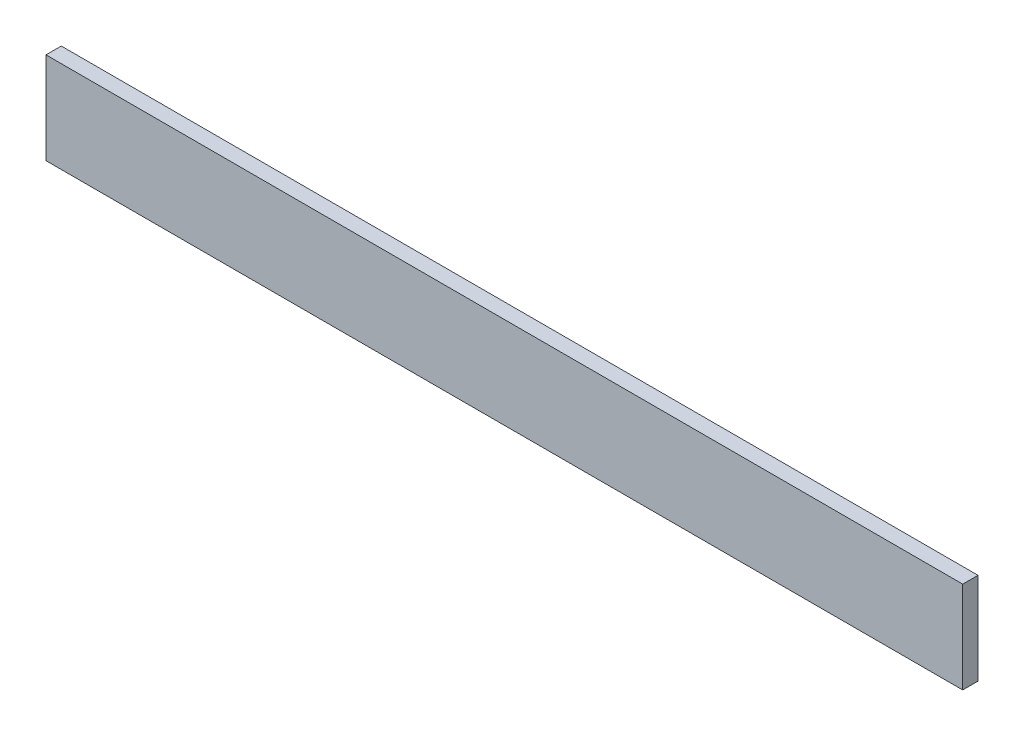
ISO-10303-21;
HEADER;
FILE_DESCRIPTION(('STEP AP214'),'2;1');
FILE_NAME('part.step','',(''),(''),'','','');
FILE_SCHEMA(('AUTOMOTIVE_DESIGN { 1 0 10303 214 1 1 1 1 }'));
ENDSEC;
DATA;
#1=APPLICATION_CONTEXT('core data for automotive mechanical design processes');
#2=APPLICATION_PROTOCOL_DEFINITION('international standard','automotive_design',2000,#1);
#3=PRODUCT_CONTEXT('',#1,'mechanical');
#4=PRODUCT('Part','Part','',(#3));
#5=PRODUCT_RELATED_PRODUCT_CATEGORY('part','',(#4));
#6=PRODUCT_DEFINITION_FORMATION('','',#4);
#7=PRODUCT_DEFINITION_CONTEXT('part definition',#1,'design');
#8=PRODUCT_DEFINITION('design','',#6,#7);
#9=PRODUCT_DEFINITION_SHAPE('','',#8);
#10=(LENGTH_UNIT() NAMED_UNIT(*) SI_UNIT(.MILLI.,.METRE.));
#11=(NAMED_UNIT(*) PLANE_ANGLE_UNIT() SI_UNIT($,.RADIAN.));
#12=(NAMED_UNIT(*) SI_UNIT($,.STERADIAN.) SOLID_ANGLE_UNIT());
#13=UNCERTAINTY_MEASURE_WITH_UNIT(LENGTH_MEASURE(1.E-05),#10,'distance_accuracy_value','');
#14=(GEOMETRIC_REPRESENTATION_CONTEXT(3) GLOBAL_UNCERTAINTY_ASSIGNED_CONTEXT((#13)) GLOBAL_UNIT_ASSIGNED_CONTEXT((#10,
#11,#12)) REPRESENTATION_CONTEXT('',''));
#15=CARTESIAN_POINT('',(0.,0.,0.));
#16=DIRECTION('',(0.,0.,1.));
#17=DIRECTION('',(1.,0.,0.));
#18=AXIS2_PLACEMENT_3D('',#15,#16,#17);
#19=CARTESIAN_POINT('',(0.,0.,5.));
#20=DIRECTION('',(-1.,0.,0.));
#21=DIRECTION('',(0.,-1.,0.));
#22=AXIS2_PLACEMENT_3D('',#19,#20,#21);
#23=PLANE('',#22);
#24=DIRECTION('',(0.,1.,0.));
#25=VECTOR('',#24,1.);
#26=CARTESIAN_POINT('',(0.,0.,0.));
#27=LINE('',#26,#25);
#28=CARTESIAN_POINT('',(0.,-30.,0.));
#29=VERTEX_POINT('',#28);
#30=CARTESIAN_POINT('',(0.,0.,0.));
#31=VERTEX_POINT('',#30);
#32=EDGE_CURVE('E96',#29,#31,#27,.T.);
#33=ORIENTED_EDGE('',*,*,#32,.T.);
#34=DIRECTION('',(0.,0.,-1.));
#35=VECTOR('',#34,1.);
#36=CARTESIAN_POINT('',(0.,0.,5.));
#37=LINE('',#36,#35);
#38=CARTESIAN_POINT('',(0.,0.,5.));
#39=VERTEX_POINT('',#38);
#40=EDGE_CURVE('E11',#39,#31,#37,.T.);
#41=ORIENTED_EDGE('',*,*,#40,.F.);
#42=DIRECTION('',(0.,1.,0.));
#43=VECTOR('',#42,1.);
#44=CARTESIAN_POINT('',(0.,0.,5.));
#45=LINE('',#44,#43);
#46=CARTESIAN_POINT('',(0.,-30.,5.));
#47=VERTEX_POINT('',#46);
#48=EDGE_CURVE('E84',#47,#39,#45,.T.);
#49=ORIENTED_EDGE('',*,*,#48,.F.);
#50=DIRECTION('',(0.,0.,-1.));
#51=VECTOR('',#50,1.);
#52=CARTESIAN_POINT('',(0.,-30.,5.));
#53=LINE('',#52,#51);
#54=EDGE_CURVE('E92',#47,#29,#53,.T.);
#55=ORIENTED_EDGE('',*,*,#54,.T.);
#56=EDGE_LOOP('',(#33,#41,#49,#55));
#57=FACE_BOUND('',#56,.T.);
#58=ADVANCED_FACE('F33',(#57),#23,.F.);
#59=CARTESIAN_POINT('',(0.,0.,5.));
#60=DIRECTION('',(0.,-1.,0.));
#61=DIRECTION('',(0.,0.,-1.));
#62=AXIS2_PLACEMENT_3D('',#59,#60,#61);
#63=PLANE('',#62);
#64=DIRECTION('',(-1.,0.,0.));
#65=VECTOR('',#64,1.);
#66=CARTESIAN_POINT('',(0.,0.,0.));
#67=LINE('',#66,#65);
#68=CARTESIAN_POINT('',(-300.,0.,0.));
#69=VERTEX_POINT('',#68);
#70=EDGE_CURVE('E88',#31,#69,#67,.T.);
#71=ORIENTED_EDGE('',*,*,#70,.T.);
#72=DIRECTION('',(0.,0.,-1.));
#73=VECTOR('',#72,1.);
#74=CARTESIAN_POINT('',(-300.,0.,5.));
#75=LINE('',#74,#73);
#76=CARTESIAN_POINT('',(-300.,0.,5.));
#77=VERTEX_POINT('',#76);
#78=EDGE_CURVE('E41',#77,#69,#75,.T.);
#79=ORIENTED_EDGE('',*,*,#78,.F.);
#80=DIRECTION('',(-1.,0.,0.));
#81=VECTOR('',#80,1.);
#82=CARTESIAN_POINT('',(0.,0.,5.));
#83=LINE('',#82,#81);
#84=EDGE_CURVE('E79',#39,#77,#83,.T.);
#85=ORIENTED_EDGE('',*,*,#84,.F.);
#86=ORIENTED_EDGE('',*,*,#40,.T.);
#87=EDGE_LOOP('',(#71,#79,#85,#86));
#88=FACE_BOUND('',#87,.T.);
#89=ADVANCED_FACE('F87',(#88),#63,.F.);
#90=CARTESIAN_POINT('',(-300.,0.,5.));
#91=DIRECTION('',(1.,0.,0.));
#92=DIRECTION('',(0.,0.,-1.));
#93=AXIS2_PLACEMENT_3D('',#90,#91,#92);
#94=PLANE('',#93);
#95=DIRECTION('',(0.,-1.,0.));
#96=VECTOR('',#95,1.);
#97=CARTESIAN_POINT('',(-300.,0.,0.));
#98=LINE('',#97,#96);
#99=CARTESIAN_POINT('',(-300.,-30.,0.));
#100=VERTEX_POINT('',#99);
#101=EDGE_CURVE('E66',#69,#100,#98,.T.);
#102=ORIENTED_EDGE('',*,*,#101,.T.);
#103=DIRECTION('',(0.,0.,-1.));
#104=VECTOR('',#103,1.);
#105=CARTESIAN_POINT('',(-300.,-30.,5.));
#106=LINE('',#105,#104);
#107=CARTESIAN_POINT('',(-300.,-30.,5.));
#108=VERTEX_POINT('',#107);
#109=EDGE_CURVE('E89',#108,#100,#106,.T.);
#110=ORIENTED_EDGE('',*,*,#109,.F.);
#111=DIRECTION('',(0.,-1.,0.));
#112=VECTOR('',#111,1.);
#113=CARTESIAN_POINT('',(-300.,0.,5.));
#114=LINE('',#113,#112);
#115=EDGE_CURVE('E82',#77,#108,#114,.T.);
#116=ORIENTED_EDGE('',*,*,#115,.F.);
#117=ORIENTED_EDGE('',*,*,#78,.T.);
#118=EDGE_LOOP('',(#102,#110,#116,#117));
#119=FACE_BOUND('',#118,.T.);
#120=ADVANCED_FACE('F90',(#119),#94,.F.);
#121=CARTESIAN_POINT('',(0.,-30.,5.));
#122=DIRECTION('',(0.,1.,0.));
#123=DIRECTION('',(-1.,0.,0.));
#124=AXIS2_PLACEMENT_3D('',#121,#122,#123);
#125=PLANE('',#124);
#126=DIRECTION('',(1.,0.,0.));
#127=VECTOR('',#126,1.);
#128=CARTESIAN_POINT('',(0.,-30.,0.));
#129=LINE('',#128,#127);
#130=EDGE_CURVE('E72',#100,#29,#129,.T.);
#131=ORIENTED_EDGE('',*,*,#130,.T.);
#132=ORIENTED_EDGE('',*,*,#54,.F.);
#133=DIRECTION('',(1.,0.,0.));
#134=VECTOR('',#133,1.);
#135=CARTESIAN_POINT('',(0.,-30.,5.));
#136=LINE('',#135,#134);
#137=EDGE_CURVE('E49',#108,#47,#136,.T.);
#138=ORIENTED_EDGE('',*,*,#137,.F.);
#139=ORIENTED_EDGE('',*,*,#109,.T.);
#140=EDGE_LOOP('',(#131,#132,#138,#139));
#141=FACE_BOUND('',#140,.T.);
#142=ADVANCED_FACE('F103',(#141),#125,.F.);
#143=CARTESIAN_POINT('',(0.,0.,5.));
#144=DIRECTION('',(0.,0.,-1.));
#145=DIRECTION('',(-1.,0.,0.));
#146=AXIS2_PLACEMENT_3D('',#143,#144,#145);
#147=PLANE('',#146);
#148=ORIENTED_EDGE('',*,*,#48,.T.);
#149=ORIENTED_EDGE('',*,*,#84,.T.);
#150=ORIENTED_EDGE('',*,*,#115,.T.);
#151=ORIENTED_EDGE('',*,*,#137,.T.);
#152=EDGE_LOOP('',(#148,#149,#150,#151));
#153=FACE_BOUND('',#152,.T.);
#154=ADVANCED_FACE('F80',(#153),#147,.F.);
#155=CARTESIAN_POINT('',(0.,0.,0.));
#156=DIRECTION('',(0.,0.,-1.));
#157=DIRECTION('',(-1.,0.,0.));
#158=AXIS2_PLACEMENT_3D('',#155,#156,#157);
#159=PLANE('',#158);
#160=ORIENTED_EDGE('',*,*,#32,.F.);
#161=ORIENTED_EDGE('',*,*,#130,.F.);
#162=ORIENTED_EDGE('',*,*,#101,.F.);
#163=ORIENTED_EDGE('',*,*,#70,.F.);
#164=EDGE_LOOP('',(#160,#161,#162,#163));
#165=FACE_BOUND('',#164,.T.);
#166=ADVANCED_FACE('F106',(#165),#159,.T.);
#167=CLOSED_SHELL('',(#58,#89,#120,#142,#154,#166));
#168=MANIFOLD_SOLID_BREP('B2',#167);
#169=ADVANCED_BREP_SHAPE_REPRESENTATION('',(#18,#168),#14);
#170=SHAPE_DEFINITION_REPRESENTATION(#9,#169);
ENDSEC;
END-ISO-10303-21;
